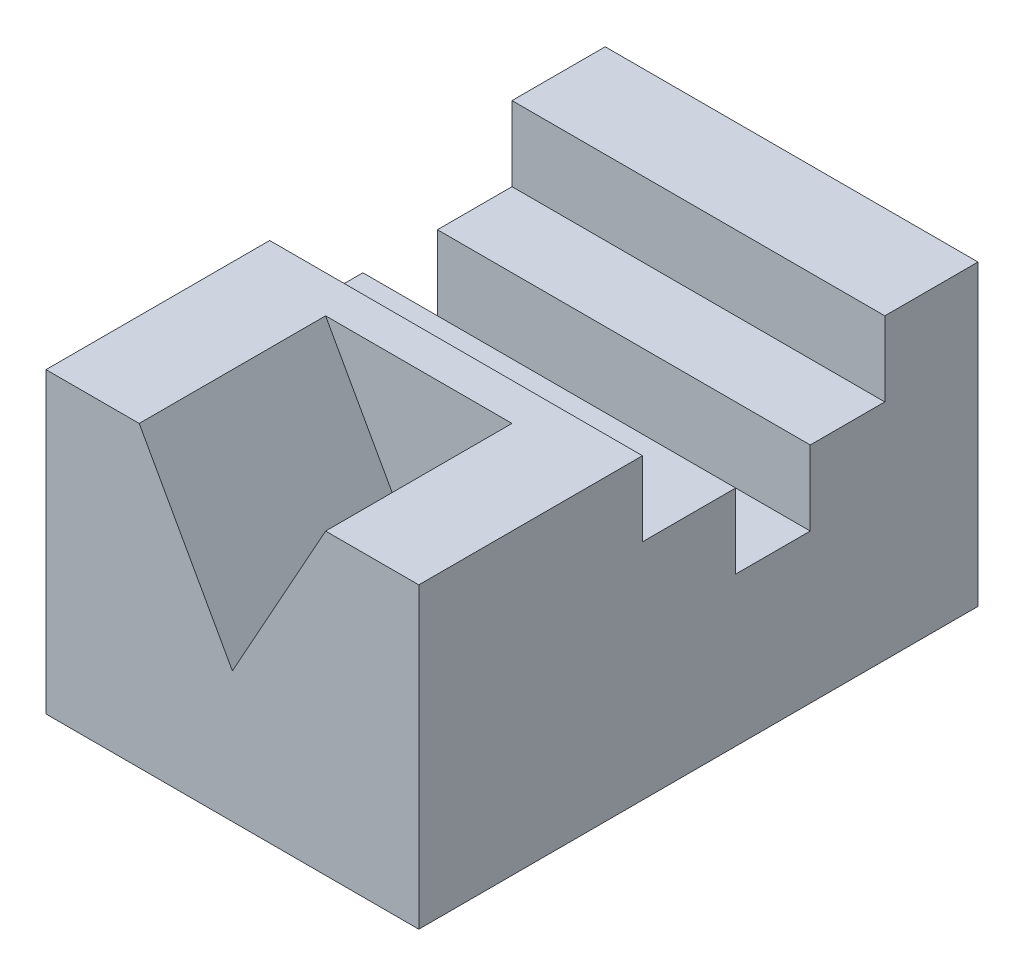
ISO-10303-21;
HEADER;
FILE_DESCRIPTION(('STEP AP214'),'2;1');
FILE_NAME('part.step','',(''),(''),'','','');
FILE_SCHEMA(('AUTOMOTIVE_DESIGN { 1 0 10303 214 1 1 1 1 }'));
ENDSEC;
DATA;
#1=APPLICATION_CONTEXT('core data for automotive mechanical design processes');
#2=APPLICATION_PROTOCOL_DEFINITION('international standard','automotive_design',2000,#1);
#3=PRODUCT_CONTEXT('',#1,'mechanical');
#4=PRODUCT('Part','Part','',(#3));
#5=PRODUCT_RELATED_PRODUCT_CATEGORY('part','',(#4));
#6=PRODUCT_DEFINITION_FORMATION('','',#4);
#7=PRODUCT_DEFINITION_CONTEXT('part definition',#1,'design');
#8=PRODUCT_DEFINITION('design','',#6,#7);
#9=PRODUCT_DEFINITION_SHAPE('','',#8);
#10=(LENGTH_UNIT() NAMED_UNIT(*) SI_UNIT(.MILLI.,.METRE.));
#11=(NAMED_UNIT(*) PLANE_ANGLE_UNIT() SI_UNIT($,.RADIAN.));
#12=(NAMED_UNIT(*) SI_UNIT($,.STERADIAN.) SOLID_ANGLE_UNIT());
#13=UNCERTAINTY_MEASURE_WITH_UNIT(LENGTH_MEASURE(1.E-05),#10,'distance_accuracy_value','');
#14=(GEOMETRIC_REPRESENTATION_CONTEXT(3) GLOBAL_UNCERTAINTY_ASSIGNED_CONTEXT((#13)) GLOBAL_UNIT_ASSIGNED_CONTEXT((#10,
#11,#12)) REPRESENTATION_CONTEXT('',''));
#15=CARTESIAN_POINT('',(0.,0.,0.));
#16=DIRECTION('',(0.,0.,1.));
#17=DIRECTION('',(1.,0.,0.));
#18=AXIS2_PLACEMENT_3D('',#15,#16,#17);
#19=CARTESIAN_POINT('',(50.,80.,75.));
#20=DIRECTION('',(-1.,0.,0.));
#21=DIRECTION('',(0.,0.,1.));
#22=AXIS2_PLACEMENT_3D('',#19,#20,#21);
#23=PLANE('',#22);
#24=DIRECTION('',(0.,1.,0.));
#25=VECTOR('',#24,1.);
#26=CARTESIAN_POINT('',(50.,80.,-50.));
#27=LINE('',#26,#25);
#28=CARTESIAN_POINT('',(50.,60.,-50.));
#29=VERTEX_POINT('',#28);
#30=CARTESIAN_POINT('',(50.,80.,-50.));
#31=VERTEX_POINT('',#30);
#32=EDGE_CURVE('E196',#29,#31,#27,.T.);
#33=ORIENTED_EDGE('',*,*,#32,.F.);
#34=DIRECTION('',(0.,0.,-1.));
#35=VECTOR('',#34,1.);
#36=CARTESIAN_POINT('',(50.,60.,-50.));
#37=LINE('',#36,#35);
#38=CARTESIAN_POINT('',(50.,60.,-30.));
#39=VERTEX_POINT('',#38);
#40=EDGE_CURVE('E363',#39,#29,#37,.T.);
#41=ORIENTED_EDGE('',*,*,#40,.F.);
#42=DIRECTION('',(0.,1.,0.));
#43=VECTOR('',#42,1.);
#44=CARTESIAN_POINT('',(50.,60.,-30.));
#45=LINE('',#44,#43);
#46=CARTESIAN_POINT('',(50.,40.,-30.));
#47=VERTEX_POINT('',#46);
#48=EDGE_CURVE('E368',#47,#39,#45,.T.);
#49=ORIENTED_EDGE('',*,*,#48,.F.);
#50=DIRECTION('',(0.,0.,-1.));
#51=VECTOR('',#50,1.);
#52=CARTESIAN_POINT('',(50.,40.,-30.));
#53=LINE('',#52,#51);
#54=CARTESIAN_POINT('',(50.,40.,-9.99999999999999));
#55=VERTEX_POINT('',#54);
#56=EDGE_CURVE('E372',#55,#47,#53,.T.);
#57=ORIENTED_EDGE('',*,*,#56,.F.);
#58=DIRECTION('',(0.,-1.,0.));
#59=VECTOR('',#58,1.);
#60=CARTESIAN_POINT('',(50.,40.,-9.99999999999999));
#61=LINE('',#60,#59);
#62=CARTESIAN_POINT('',(50.,60.,-9.99999999999999));
#63=VERTEX_POINT('',#62);
#64=EDGE_CURVE('E376',#63,#55,#61,.T.);
#65=ORIENTED_EDGE('',*,*,#64,.F.);
#66=DIRECTION('',(0.,0.,-1.));
#67=VECTOR('',#66,1.);
#68=CARTESIAN_POINT('',(50.,60.,-9.99999999999999));
#69=LINE('',#68,#67);
#70=CARTESIAN_POINT('',(50.,60.,15.));
#71=VERTEX_POINT('',#70);
#72=EDGE_CURVE('E205',#71,#63,#69,.T.);
#73=ORIENTED_EDGE('',*,*,#72,.F.);
#74=DIRECTION('',(0.,-1.,0.));
#75=VECTOR('',#74,1.);
#76=CARTESIAN_POINT('',(50.,60.,15.));
#77=LINE('',#76,#75);
#78=CARTESIAN_POINT('',(50.,80.,15.));
#79=VERTEX_POINT('',#78);
#80=EDGE_CURVE('E189',#79,#71,#77,.T.);
#81=ORIENTED_EDGE('',*,*,#80,.F.);
#82=DIRECTION('',(0.,0.,-1.));
#83=VECTOR('',#82,1.);
#84=CARTESIAN_POINT('',(50.,80.,75.));
#85=LINE('',#84,#83);
#86=CARTESIAN_POINT('',(50.,80.,75.));
#87=VERTEX_POINT('',#86);
#88=EDGE_CURVE('E202',#87,#79,#85,.T.);
#89=ORIENTED_EDGE('',*,*,#88,.F.);
#90=DIRECTION('',(0.,-1.,0.));
#91=VECTOR('',#90,1.);
#92=CARTESIAN_POINT('',(50.,80.,75.));
#93=LINE('',#92,#91);
#94=CARTESIAN_POINT('',(50.,0.,75.));
#95=VERTEX_POINT('',#94);
#96=EDGE_CURVE('E234',#87,#95,#93,.T.);
#97=ORIENTED_EDGE('',*,*,#96,.T.);
#98=DIRECTION('',(0.,0.,-1.));
#99=VECTOR('',#98,1.);
#100=CARTESIAN_POINT('',(50.,0.,75.));
#101=LINE('',#100,#99);
#102=CARTESIAN_POINT('',(50.,0.,-75.));
#103=VERTEX_POINT('',#102);
#104=EDGE_CURVE('E235',#95,#103,#101,.T.);
#105=ORIENTED_EDGE('',*,*,#104,.T.);
#106=DIRECTION('',(0.,-1.,0.));
#107=VECTOR('',#106,1.);
#108=CARTESIAN_POINT('',(50.,80.,-75.));
#109=LINE('',#108,#107);
#110=CARTESIAN_POINT('',(50.,80.,-75.));
#111=VERTEX_POINT('',#110);
#112=EDGE_CURVE('E13',#111,#103,#109,.T.);
#113=ORIENTED_EDGE('',*,*,#112,.F.);
#114=EDGE_CURVE('E215',#31,#111,#85,.T.);
#115=ORIENTED_EDGE('',*,*,#114,.F.);
#116=EDGE_LOOP('',(#33,#41,#49,#57,#65,#73,#81,#89,#97,#105,#113,#115));
#117=FACE_BOUND('',#116,.T.);
#118=ADVANCED_FACE('F80',(#117),#23,.F.);
#119=CARTESIAN_POINT('',(-50.,80.,75.));
#120=DIRECTION('',(1.,0.,0.));
#121=DIRECTION('',(0.,0.,-1.));
#122=AXIS2_PLACEMENT_3D('',#119,#120,#121);
#123=PLANE('',#122);
#124=DIRECTION('',(0.,1.,0.));
#125=VECTOR('',#124,1.);
#126=CARTESIAN_POINT('',(-50.,80.,-50.));
#127=LINE('',#126,#125);
#128=CARTESIAN_POINT('',(-50.,60.,-50.));
#129=VERTEX_POINT('',#128);
#130=CARTESIAN_POINT('',(-50.,80.,-50.));
#131=VERTEX_POINT('',#130);
#132=EDGE_CURVE('E207',#129,#131,#127,.T.);
#133=ORIENTED_EDGE('',*,*,#132,.T.);
#134=DIRECTION('',(0.,0.,1.));
#135=VECTOR('',#134,1.);
#136=CARTESIAN_POINT('',(-50.,80.,75.));
#137=LINE('',#136,#135);
#138=CARTESIAN_POINT('',(-50.,80.,-75.));
#139=VERTEX_POINT('',#138);
#140=EDGE_CURVE('E226',#139,#131,#137,.T.);
#141=ORIENTED_EDGE('',*,*,#140,.F.);
#142=DIRECTION('',(0.,-1.,0.));
#143=VECTOR('',#142,1.);
#144=CARTESIAN_POINT('',(-50.,80.,-75.));
#145=LINE('',#144,#143);
#146=CARTESIAN_POINT('',(-50.,0.,-75.));
#147=VERTEX_POINT('',#146);
#148=EDGE_CURVE('E88',#139,#147,#145,.T.);
#149=ORIENTED_EDGE('',*,*,#148,.T.);
#150=DIRECTION('',(0.,0.,1.));
#151=VECTOR('',#150,1.);
#152=CARTESIAN_POINT('',(-50.,0.,75.));
#153=LINE('',#152,#151);
#154=CARTESIAN_POINT('',(-50.,0.,75.));
#155=VERTEX_POINT('',#154);
#156=EDGE_CURVE('E241',#147,#155,#153,.T.);
#157=ORIENTED_EDGE('',*,*,#156,.T.);
#158=DIRECTION('',(0.,-1.,0.));
#159=VECTOR('',#158,1.);
#160=CARTESIAN_POINT('',(-50.,80.,75.));
#161=LINE('',#160,#159);
#162=CARTESIAN_POINT('',(-50.,80.,75.));
#163=VERTEX_POINT('',#162);
#164=EDGE_CURVE('E248',#163,#155,#161,.T.);
#165=ORIENTED_EDGE('',*,*,#164,.F.);
#166=CARTESIAN_POINT('',(-50.,80.,15.));
#167=VERTEX_POINT('',#166);
#168=EDGE_CURVE('E219',#167,#163,#137,.T.);
#169=ORIENTED_EDGE('',*,*,#168,.F.);
#170=DIRECTION('',(0.,-1.,0.));
#171=VECTOR('',#170,1.);
#172=CARTESIAN_POINT('',(-50.,60.,15.));
#173=LINE('',#172,#171);
#174=CARTESIAN_POINT('',(-50.,60.,15.));
#175=VERTEX_POINT('',#174);
#176=EDGE_CURVE('E95',#167,#175,#173,.T.);
#177=ORIENTED_EDGE('',*,*,#176,.T.);
#178=DIRECTION('',(0.,0.,-1.));
#179=VECTOR('',#178,1.);
#180=CARTESIAN_POINT('',(-50.,60.,-9.99999999999999));
#181=LINE('',#180,#179);
#182=CARTESIAN_POINT('',(-50.,60.,-9.99999999999999));
#183=VERTEX_POINT('',#182);
#184=EDGE_CURVE('E336',#175,#183,#181,.T.);
#185=ORIENTED_EDGE('',*,*,#184,.T.);
#186=DIRECTION('',(0.,-1.,0.));
#187=VECTOR('',#186,1.);
#188=CARTESIAN_POINT('',(-50.,40.,-9.99999999999999));
#189=LINE('',#188,#187);
#190=CARTESIAN_POINT('',(-50.,40.,-9.99999999999999));
#191=VERTEX_POINT('',#190);
#192=EDGE_CURVE('E340',#183,#191,#189,.T.);
#193=ORIENTED_EDGE('',*,*,#192,.T.);
#194=DIRECTION('',(0.,0.,-1.));
#195=VECTOR('',#194,1.);
#196=CARTESIAN_POINT('',(-50.,40.,-30.));
#197=LINE('',#196,#195);
#198=CARTESIAN_POINT('',(-50.,40.,-30.));
#199=VERTEX_POINT('',#198);
#200=EDGE_CURVE('E347',#191,#199,#197,.T.);
#201=ORIENTED_EDGE('',*,*,#200,.T.);
#202=DIRECTION('',(0.,1.,0.));
#203=VECTOR('',#202,1.);
#204=CARTESIAN_POINT('',(-50.,60.,-30.));
#205=LINE('',#204,#203);
#206=CARTESIAN_POINT('',(-50.,60.,-30.));
#207=VERTEX_POINT('',#206);
#208=EDGE_CURVE('E351',#199,#207,#205,.T.);
#209=ORIENTED_EDGE('',*,*,#208,.T.);
#210=DIRECTION('',(0.,0.,-1.));
#211=VECTOR('',#210,1.);
#212=CARTESIAN_POINT('',(-50.,60.,-50.));
#213=LINE('',#212,#211);
#214=EDGE_CURVE('E354',#207,#129,#213,.T.);
#215=ORIENTED_EDGE('',*,*,#214,.T.);
#216=EDGE_LOOP('',(#133,#141,#149,#157,#165,#169,#177,#185,#193,#201,#209,#215));
#217=FACE_BOUND('',#216,.T.);
#218=ADVANCED_FACE('F258',(#217),#123,.F.);
#219=CARTESIAN_POINT('',(0.,80.,0.));
#220=DIRECTION('',(0.,-1.,0.));
#221=DIRECTION('',(0.,0.,-1.));
#222=AXIS2_PLACEMENT_3D('',#219,#220,#221);
#223=PLANE('',#222);
#224=DIRECTION('',(-1.,0.,0.));
#225=VECTOR('',#224,1.);
#226=CARTESIAN_POINT('',(50.,80.,-50.));
#227=LINE('',#226,#225);
#228=EDGE_CURVE('E276',#31,#131,#227,.T.);
#229=ORIENTED_EDGE('',*,*,#228,.F.);
#230=ORIENTED_EDGE('',*,*,#114,.T.);
#231=DIRECTION('',(-1.,0.,0.));
#232=VECTOR('',#231,1.);
#233=CARTESIAN_POINT('',(-50.,80.,-75.));
#234=LINE('',#233,#232);
#235=EDGE_CURVE('E214',#111,#139,#234,.T.);
#236=ORIENTED_EDGE('',*,*,#235,.T.);
#237=ORIENTED_EDGE('',*,*,#140,.T.);
#238=EDGE_LOOP('',(#229,#230,#236,#237));
#239=FACE_BOUND('',#238,.T.);
#240=ADVANCED_FACE('F275',(#239),#223,.F.);
#241=DIRECTION('',(-1.,0.,0.));
#242=VECTOR('',#241,1.);
#243=CARTESIAN_POINT('',(50.,80.,15.));
#244=LINE('',#243,#242);
#245=EDGE_CURVE('E186',#79,#167,#244,.T.);
#246=ORIENTED_EDGE('',*,*,#245,.T.);
#247=ORIENTED_EDGE('',*,*,#168,.T.);
#248=DIRECTION('',(1.,0.,0.));
#249=VECTOR('',#248,1.);
#250=CARTESIAN_POINT('',(-50.,80.,75.));
#251=LINE('',#250,#249);
#252=CARTESIAN_POINT('',(-25.,80.,75.));
#253=VERTEX_POINT('',#252);
#254=EDGE_CURVE('E230',#163,#253,#251,.T.);
#255=ORIENTED_EDGE('',*,*,#254,.T.);
#256=DIRECTION('',(0.,0.,1.));
#257=VECTOR('',#256,1.);
#258=CARTESIAN_POINT('',(-25.,80.,25.));
#259=LINE('',#258,#257);
#260=CARTESIAN_POINT('',(-25.,80.,25.));
#261=VERTEX_POINT('',#260);
#262=EDGE_CURVE('E318',#261,#253,#259,.T.);
#263=ORIENTED_EDGE('',*,*,#262,.F.);
#264=DIRECTION('',(-1.,0.,0.));
#265=VECTOR('',#264,1.);
#266=CARTESIAN_POINT('',(0.,80.,25.));
#267=LINE('',#266,#265);
#268=CARTESIAN_POINT('',(25.,80.,25.));
#269=VERTEX_POINT('',#268);
#270=EDGE_CURVE('E223',#269,#261,#267,.T.);
#271=ORIENTED_EDGE('',*,*,#270,.F.);
#272=DIRECTION('',(0.,0.,1.));
#273=VECTOR('',#272,1.);
#274=CARTESIAN_POINT('',(25.,80.,25.));
#275=LINE('',#274,#273);
#276=CARTESIAN_POINT('',(25.,80.,75.));
#277=VERTEX_POINT('',#276);
#278=EDGE_CURVE('E310',#269,#277,#275,.T.);
#279=ORIENTED_EDGE('',*,*,#278,.T.);
#280=EDGE_CURVE('E211',#277,#87,#251,.T.);
#281=ORIENTED_EDGE('',*,*,#280,.T.);
#282=ORIENTED_EDGE('',*,*,#88,.T.);
#283=EDGE_LOOP('',(#246,#247,#255,#263,#271,#279,#281,#282));
#284=FACE_BOUND('',#283,.T.);
#285=ADVANCED_FACE('F209',(#284),#223,.F.);
#286=CARTESIAN_POINT('',(-50.,80.,-75.));
#287=DIRECTION('',(0.,0.,1.));
#288=DIRECTION('',(1.,0.,0.));
#289=AXIS2_PLACEMENT_3D('',#286,#287,#288);
#290=PLANE('',#289);
#291=DIRECTION('',(-1.,0.,0.));
#292=VECTOR('',#291,1.);
#293=CARTESIAN_POINT('',(-50.,0.,-75.));
#294=LINE('',#293,#292);
#295=EDGE_CURVE('E238',#103,#147,#294,.T.);
#296=ORIENTED_EDGE('',*,*,#295,.T.);
#297=ORIENTED_EDGE('',*,*,#148,.F.);
#298=ORIENTED_EDGE('',*,*,#235,.F.);
#299=ORIENTED_EDGE('',*,*,#112,.T.);
#300=EDGE_LOOP('',(#296,#297,#298,#299));
#301=FACE_BOUND('',#300,.T.);
#302=ADVANCED_FACE('F272',(#301),#290,.F.);
#303=CARTESIAN_POINT('',(-50.,80.,75.));
#304=DIRECTION('',(0.,0.,-1.));
#305=DIRECTION('',(-1.,0.,0.));
#306=AXIS2_PLACEMENT_3D('',#303,#304,#305);
#307=PLANE('',#306);
#308=DIRECTION('',(0.485642931178632,0.874157276121538,0.));
#309=VECTOR('',#308,1.);
#310=CARTESIAN_POINT('',(0.,35.,75.));
#311=LINE('',#310,#309);
#312=CARTESIAN_POINT('',(0.,35.,75.));
#313=VERTEX_POINT('',#312);
#314=EDGE_CURVE('E103',#313,#277,#311,.T.);
#315=ORIENTED_EDGE('',*,*,#314,.F.);
#316=DIRECTION('',(0.485642931178632,-0.874157276121538,0.));
#317=VECTOR('',#316,1.);
#318=CARTESIAN_POINT('',(-25.,80.,75.));
#319=LINE('',#318,#317);
#320=EDGE_CURVE('E280',#253,#313,#319,.T.);
#321=ORIENTED_EDGE('',*,*,#320,.F.);
#322=ORIENTED_EDGE('',*,*,#254,.F.);
#323=ORIENTED_EDGE('',*,*,#164,.T.);
#324=DIRECTION('',(1.,0.,0.));
#325=VECTOR('',#324,1.);
#326=CARTESIAN_POINT('',(-50.,0.,75.));
#327=LINE('',#326,#325);
#328=EDGE_CURVE('E221',#155,#95,#327,.T.);
#329=ORIENTED_EDGE('',*,*,#328,.T.);
#330=ORIENTED_EDGE('',*,*,#96,.F.);
#331=ORIENTED_EDGE('',*,*,#280,.F.);
#332=EDGE_LOOP('',(#315,#321,#322,#323,#329,#330,#331));
#333=FACE_BOUND('',#332,.T.);
#334=ADVANCED_FACE('F268',(#333),#307,.F.);
#335=CARTESIAN_POINT('',(0.,0.,0.));
#336=DIRECTION('',(0.,-1.,0.));
#337=DIRECTION('',(0.,0.,-1.));
#338=AXIS2_PLACEMENT_3D('',#335,#336,#337);
#339=PLANE('',#338);
#340=ORIENTED_EDGE('',*,*,#328,.F.);
#341=ORIENTED_EDGE('',*,*,#156,.F.);
#342=ORIENTED_EDGE('',*,*,#295,.F.);
#343=ORIENTED_EDGE('',*,*,#104,.F.);
#344=EDGE_LOOP('',(#340,#341,#342,#343));
#345=FACE_BOUND('',#344,.T.);
#346=ADVANCED_FACE('F265',(#345),#339,.T.);
#347=CARTESIAN_POINT('',(0.,40.,25.));
#348=DIRECTION('',(0.,0.,1.));
#349=DIRECTION('',(1.,0.,0.));
#350=AXIS2_PLACEMENT_3D('',#347,#348,#349);
#351=PLANE('',#350);
#352=ORIENTED_EDGE('',*,*,#270,.T.);
#353=DIRECTION('',(0.485642931178632,-0.874157276121538,0.));
#354=VECTOR('',#353,1.);
#355=CARTESIAN_POINT('',(-25.,80.,25.));
#356=LINE('',#355,#354);
#357=CARTESIAN_POINT('',(0.,35.,25.));
#358=VERTEX_POINT('',#357);
#359=EDGE_CURVE('E305',#261,#358,#356,.T.);
#360=ORIENTED_EDGE('',*,*,#359,.T.);
#361=DIRECTION('',(0.485642931178632,0.874157276121538,0.));
#362=VECTOR('',#361,1.);
#363=CARTESIAN_POINT('',(0.,35.,25.));
#364=LINE('',#363,#362);
#365=EDGE_CURVE('E308',#358,#269,#364,.T.);
#366=ORIENTED_EDGE('',*,*,#365,.T.);
#367=EDGE_LOOP('',(#352,#360,#366));
#368=FACE_BOUND('',#367,.T.);
#369=ADVANCED_FACE('F327',(#368),#351,.T.);
#370=CARTESIAN_POINT('',(-25.,80.,25.));
#371=DIRECTION('',(-0.874157276121538,-0.485642931178632,0.));
#372=DIRECTION('',(0.485642931178632,-0.874157276121538,0.));
#373=AXIS2_PLACEMENT_3D('',#370,#371,#372);
#374=PLANE('',#373);
#375=ORIENTED_EDGE('',*,*,#320,.T.);
#376=DIRECTION('',(0.,0.,1.));
#377=VECTOR('',#376,1.);
#378=CARTESIAN_POINT('',(0.,35.,25.));
#379=LINE('',#378,#377);
#380=EDGE_CURVE('E316',#358,#313,#379,.T.);
#381=ORIENTED_EDGE('',*,*,#380,.F.);
#382=ORIENTED_EDGE('',*,*,#359,.F.);
#383=ORIENTED_EDGE('',*,*,#262,.T.);
#384=EDGE_LOOP('',(#375,#381,#382,#383));
#385=FACE_BOUND('',#384,.T.);
#386=ADVANCED_FACE('F330',(#385),#374,.F.);
#387=CARTESIAN_POINT('',(0.,35.,25.));
#388=DIRECTION('',(0.874157276121538,-0.485642931178632,0.));
#389=DIRECTION('',(0.485642931178632,0.874157276121538,0.));
#390=AXIS2_PLACEMENT_3D('',#387,#388,#389);
#391=PLANE('',#390);
#392=ORIENTED_EDGE('',*,*,#314,.T.);
#393=ORIENTED_EDGE('',*,*,#278,.F.);
#394=ORIENTED_EDGE('',*,*,#365,.F.);
#395=ORIENTED_EDGE('',*,*,#380,.T.);
#396=EDGE_LOOP('',(#392,#393,#394,#395));
#397=FACE_BOUND('',#396,.T.);
#398=ADVANCED_FACE('F431',(#397),#391,.F.);
#399=CARTESIAN_POINT('',(50.,80.,-50.));
#400=DIRECTION('',(0.,0.,1.));
#401=DIRECTION('',(0.,-1.,0.));
#402=AXIS2_PLACEMENT_3D('',#399,#400,#401);
#403=PLANE('',#402);
#404=ORIENTED_EDGE('',*,*,#132,.F.);
#405=DIRECTION('',(-1.,0.,0.));
#406=VECTOR('',#405,1.);
#407=CARTESIAN_POINT('',(50.,60.,-50.));
#408=LINE('',#407,#406);
#409=EDGE_CURVE('E281',#29,#129,#408,.T.);
#410=ORIENTED_EDGE('',*,*,#409,.F.);
#411=ORIENTED_EDGE('',*,*,#32,.T.);
#412=ORIENTED_EDGE('',*,*,#228,.T.);
#413=EDGE_LOOP('',(#404,#410,#411,#412));
#414=FACE_BOUND('',#413,.T.);
#415=ADVANCED_FACE('F359',(#414),#403,.T.);
#416=CARTESIAN_POINT('',(50.,60.,-50.));
#417=DIRECTION('',(0.,1.,0.));
#418=DIRECTION('',(0.,0.,1.));
#419=AXIS2_PLACEMENT_3D('',#416,#417,#418);
#420=PLANE('',#419);
#421=ORIENTED_EDGE('',*,*,#214,.F.);
#422=DIRECTION('',(-1.,0.,0.));
#423=VECTOR('',#422,1.);
#424=CARTESIAN_POINT('',(50.,60.,-30.));
#425=LINE('',#424,#423);
#426=EDGE_CURVE('E287',#39,#207,#425,.T.);
#427=ORIENTED_EDGE('',*,*,#426,.F.);
#428=ORIENTED_EDGE('',*,*,#40,.T.);
#429=ORIENTED_EDGE('',*,*,#409,.T.);
#430=EDGE_LOOP('',(#421,#427,#428,#429));
#431=FACE_BOUND('',#430,.T.);
#432=ADVANCED_FACE('F364',(#431),#420,.T.);
#433=CARTESIAN_POINT('',(50.,60.,-30.));
#434=DIRECTION('',(0.,0.,1.));
#435=DIRECTION('',(0.,-1.,0.));
#436=AXIS2_PLACEMENT_3D('',#433,#434,#435);
#437=PLANE('',#436);
#438=ORIENTED_EDGE('',*,*,#208,.F.);
#439=DIRECTION('',(-1.,0.,0.));
#440=VECTOR('',#439,1.);
#441=CARTESIAN_POINT('',(50.,40.,-30.));
#442=LINE('',#441,#440);
#443=EDGE_CURVE('E294',#47,#199,#442,.T.);
#444=ORIENTED_EDGE('',*,*,#443,.F.);
#445=ORIENTED_EDGE('',*,*,#48,.T.);
#446=ORIENTED_EDGE('',*,*,#426,.T.);
#447=EDGE_LOOP('',(#438,#444,#445,#446));
#448=FACE_BOUND('',#447,.T.);
#449=ADVANCED_FACE('F393',(#448),#437,.T.);
#450=CARTESIAN_POINT('',(50.,40.,-30.));
#451=DIRECTION('',(0.,1.,0.));
#452=DIRECTION('',(0.,0.,1.));
#453=AXIS2_PLACEMENT_3D('',#450,#451,#452);
#454=PLANE('',#453);
#455=ORIENTED_EDGE('',*,*,#200,.F.);
#456=DIRECTION('',(-1.,0.,0.));
#457=VECTOR('',#456,1.);
#458=CARTESIAN_POINT('',(50.,40.,-9.99999999999999));
#459=LINE('',#458,#457);
#460=EDGE_CURVE('E297',#55,#191,#459,.T.);
#461=ORIENTED_EDGE('',*,*,#460,.F.);
#462=ORIENTED_EDGE('',*,*,#56,.T.);
#463=ORIENTED_EDGE('',*,*,#443,.T.);
#464=EDGE_LOOP('',(#455,#461,#462,#463));
#465=FACE_BOUND('',#464,.T.);
#466=ADVANCED_FACE('F391',(#465),#454,.T.);
#467=CARTESIAN_POINT('',(50.,40.,-9.99999999999999));
#468=DIRECTION('',(0.,0.,-1.));
#469=DIRECTION('',(-1.,0.,0.));
#470=AXIS2_PLACEMENT_3D('',#467,#468,#469);
#471=PLANE('',#470);
#472=ORIENTED_EDGE('',*,*,#192,.F.);
#473=DIRECTION('',(-1.,0.,0.));
#474=VECTOR('',#473,1.);
#475=CARTESIAN_POINT('',(50.,60.,-9.99999999999999));
#476=LINE('',#475,#474);
#477=EDGE_CURVE('E300',#63,#183,#476,.T.);
#478=ORIENTED_EDGE('',*,*,#477,.F.);
#479=ORIENTED_EDGE('',*,*,#64,.T.);
#480=ORIENTED_EDGE('',*,*,#460,.T.);
#481=EDGE_LOOP('',(#472,#478,#479,#480));
#482=FACE_BOUND('',#481,.T.);
#483=ADVANCED_FACE('F387',(#482),#471,.T.);
#484=CARTESIAN_POINT('',(50.,60.,-9.99999999999999));
#485=DIRECTION('',(0.,1.,0.));
#486=DIRECTION('',(0.,0.,1.));
#487=AXIS2_PLACEMENT_3D('',#484,#485,#486);
#488=PLANE('',#487);
#489=ORIENTED_EDGE('',*,*,#184,.F.);
#490=DIRECTION('',(-1.,0.,0.));
#491=VECTOR('',#490,1.);
#492=CARTESIAN_POINT('',(50.,60.,15.));
#493=LINE('',#492,#491);
#494=EDGE_CURVE('E195',#71,#175,#493,.T.);
#495=ORIENTED_EDGE('',*,*,#494,.F.);
#496=ORIENTED_EDGE('',*,*,#72,.T.);
#497=ORIENTED_EDGE('',*,*,#477,.T.);
#498=EDGE_LOOP('',(#489,#495,#496,#497));
#499=FACE_BOUND('',#498,.T.);
#500=ADVANCED_FACE('F383',(#499),#488,.T.);
#501=CARTESIAN_POINT('',(50.,60.,15.));
#502=DIRECTION('',(0.,0.,-1.));
#503=DIRECTION('',(-1.,0.,0.));
#504=AXIS2_PLACEMENT_3D('',#501,#502,#503);
#505=PLANE('',#504);
#506=ORIENTED_EDGE('',*,*,#176,.F.);
#507=ORIENTED_EDGE('',*,*,#245,.F.);
#508=ORIENTED_EDGE('',*,*,#80,.T.);
#509=ORIENTED_EDGE('',*,*,#494,.T.);
#510=EDGE_LOOP('',(#506,#507,#508,#509));
#511=FACE_BOUND('',#510,.T.);
#512=ADVANCED_FACE('F188',(#511),#505,.T.);
#513=CLOSED_SHELL('',(#118,#218,#240,#285,#302,#334,#346,#369,#386,#398,#415,#432,#449,#466,
#483,#500,#512));
#514=MANIFOLD_SOLID_BREP('B2',#513);
#515=ADVANCED_BREP_SHAPE_REPRESENTATION('',(#18,#514),#14);
#516=SHAPE_DEFINITION_REPRESENTATION(#9,#515);
ENDSEC;
END-ISO-10303-21;
